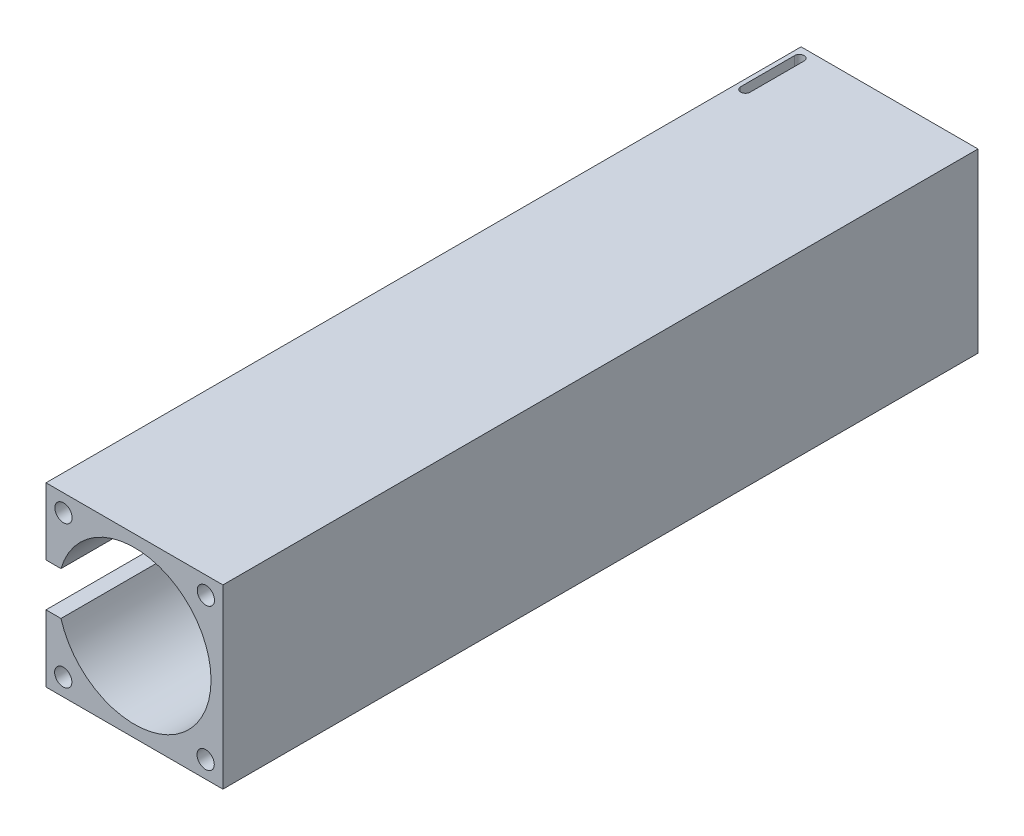
ISO-10303-21;
HEADER;
FILE_DESCRIPTION(('STEP AP214'),'2;1');
FILE_NAME('part.step','',(''),(''),'','','');
FILE_SCHEMA(('AUTOMOTIVE_DESIGN { 1 0 10303 214 1 1 1 1 }'));
ENDSEC;
DATA;
#1=APPLICATION_CONTEXT('core data for automotive mechanical design processes');
#2=APPLICATION_PROTOCOL_DEFINITION('international standard','automotive_design',2000,#1);
#3=PRODUCT_CONTEXT('',#1,'mechanical');
#4=PRODUCT('Part','Part','',(#3));
#5=PRODUCT_RELATED_PRODUCT_CATEGORY('part','',(#4));
#6=PRODUCT_DEFINITION_FORMATION('','',#4);
#7=PRODUCT_DEFINITION_CONTEXT('part definition',#1,'design');
#8=PRODUCT_DEFINITION('design','',#6,#7);
#9=PRODUCT_DEFINITION_SHAPE('','',#8);
#10=(LENGTH_UNIT() NAMED_UNIT(*) SI_UNIT(.MILLI.,.METRE.));
#11=(NAMED_UNIT(*) PLANE_ANGLE_UNIT() SI_UNIT($,.RADIAN.));
#12=(NAMED_UNIT(*) SI_UNIT($,.STERADIAN.) SOLID_ANGLE_UNIT());
#13=UNCERTAINTY_MEASURE_WITH_UNIT(LENGTH_MEASURE(1.E-05),#10,'distance_accuracy_value','');
#14=(GEOMETRIC_REPRESENTATION_CONTEXT(3) GLOBAL_UNCERTAINTY_ASSIGNED_CONTEXT((#13)) GLOBAL_UNIT_ASSIGNED_CONTEXT((#10,
#11,#12)) REPRESENTATION_CONTEXT('',''));
#15=CARTESIAN_POINT('',(0.,0.,0.));
#16=DIRECTION('',(0.,0.,1.));
#17=DIRECTION('',(1.,0.,0.));
#18=AXIS2_PLACEMENT_3D('',#15,#16,#17);
#19=CARTESIAN_POINT('',(-36.8,29.,-5.));
#20=DIRECTION('',(0.,1.,0.));
#21=DIRECTION('',(0.,0.,1.));
#22=AXIS2_PLACEMENT_3D('',#19,#20,#21);
#23=CYLINDRICAL_SURFACE('',#22,2.20000000000001);
#24=CARTESIAN_POINT('',(-36.8,36.,-5.));
#25=DIRECTION('',(0.,1.,0.));
#26=DIRECTION('',(0.,0.,1.));
#27=AXIS2_PLACEMENT_3D('',#24,#25,#26);
#28=CIRCLE('',#27,2.20000000000001);
#29=CARTESIAN_POINT('',(-34.6,36.,-5.));
#30=VERTEX_POINT('',#29);
#31=CARTESIAN_POINT('',(-36.8,36.,-2.8));
#32=VERTEX_POINT('',#31);
#33=EDGE_CURVE('E57',#30,#32,#28,.F.);
#34=ORIENTED_EDGE('',*,*,#33,.T.);
#35=CARTESIAN_POINT('',(-39.,36.,-5.));
#36=VERTEX_POINT('',#35);
#37=EDGE_CURVE('E244',#32,#36,#28,.F.);
#38=ORIENTED_EDGE('',*,*,#37,.T.);
#39=DIRECTION('',(0.,1.,0.));
#40=VECTOR('',#39,1.);
#41=CARTESIAN_POINT('',(-39.,29.,-5.));
#42=LINE('',#41,#40);
#43=CARTESIAN_POINT('',(-39.,41.,-5.));
#44=VERTEX_POINT('',#43);
#45=EDGE_CURVE('E277',#36,#44,#42,.T.);
#46=ORIENTED_EDGE('',*,*,#45,.T.);
#47=CARTESIAN_POINT('',(-36.8,41.,-5.));
#48=DIRECTION('',(0.,1.,0.));
#49=DIRECTION('',(0.,0.,1.));
#50=AXIS2_PLACEMENT_3D('',#47,#48,#49);
#51=CIRCLE('',#50,2.20000000000001);
#52=CARTESIAN_POINT('',(-34.6,41.,-4.99999999999995));
#53=VERTEX_POINT('',#52);
#54=EDGE_CURVE('E248',#44,#53,#51,.T.);
#55=ORIENTED_EDGE('',*,*,#54,.T.);
#56=DIRECTION('',(0.,1.,0.));
#57=VECTOR('',#56,1.);
#58=CARTESIAN_POINT('',(-34.6,29.,-5.));
#59=LINE('',#58,#57);
#60=EDGE_CURVE('E262',#30,#53,#59,.T.);
#61=ORIENTED_EDGE('',*,*,#60,.F.);
#62=EDGE_LOOP('',(#34,#38,#46,#55,#61));
#63=FACE_BOUND('',#62,.T.);
#64=ADVANCED_FACE('F34',(#63),#23,.F.);
#65=CARTESIAN_POINT('',(-39.,29.,-5.));
#66=DIRECTION('',(-1.,0.,0.));
#67=DIRECTION('',(0.,0.,1.));
#68=AXIS2_PLACEMENT_3D('',#65,#66,#67);
#69=PLANE('',#68);
#70=ORIENTED_EDGE('',*,*,#45,.F.);
#71=DIRECTION('',(0.,0.,-1.));
#72=VECTOR('',#71,1.);
#73=CARTESIAN_POINT('',(-39.,36.,-5.));
#74=LINE('',#73,#72);
#75=CARTESIAN_POINT('',(-39.,36.,-30.));
#76=VERTEX_POINT('',#75);
#77=EDGE_CURVE('E245',#36,#76,#74,.T.);
#78=ORIENTED_EDGE('',*,*,#77,.T.);
#79=DIRECTION('',(0.,1.,0.));
#80=VECTOR('',#79,1.);
#81=CARTESIAN_POINT('',(-39.,29.,-30.));
#82=LINE('',#81,#80);
#83=CARTESIAN_POINT('',(-39.,41.,-30.));
#84=VERTEX_POINT('',#83);
#85=EDGE_CURVE('E281',#76,#84,#82,.T.);
#86=ORIENTED_EDGE('',*,*,#85,.T.);
#87=DIRECTION('',(0.,0.,1.));
#88=VECTOR('',#87,1.);
#89=CARTESIAN_POINT('',(-39.,41.,-5.));
#90=LINE('',#89,#88);
#91=EDGE_CURVE('E253',#84,#44,#90,.T.);
#92=ORIENTED_EDGE('',*,*,#91,.T.);
#93=EDGE_LOOP('',(#70,#78,#86,#92));
#94=FACE_BOUND('',#93,.T.);
#95=ADVANCED_FACE('F416',(#94),#69,.F.);
#96=CARTESIAN_POINT('',(-36.8,29.,-30.));
#97=DIRECTION('',(0.,1.,0.));
#98=DIRECTION('',(0.,0.,1.));
#99=AXIS2_PLACEMENT_3D('',#96,#97,#98);
#100=CYLINDRICAL_SURFACE('',#99,2.20000000000001);
#101=CARTESIAN_POINT('',(-36.8,36.,-30.));
#102=DIRECTION('',(0.,1.,0.));
#103=DIRECTION('',(0.,0.,1.));
#104=AXIS2_PLACEMENT_3D('',#101,#102,#103);
#105=CIRCLE('',#104,2.20000000000001);
#106=CARTESIAN_POINT('',(-36.8,36.,-32.2));
#107=VERTEX_POINT('',#106);
#108=EDGE_CURVE('E242',#76,#107,#105,.F.);
#109=ORIENTED_EDGE('',*,*,#108,.T.);
#110=CARTESIAN_POINT('',(-34.6,36.,-30.));
#111=VERTEX_POINT('',#110);
#112=EDGE_CURVE('E239',#107,#111,#105,.F.);
#113=ORIENTED_EDGE('',*,*,#112,.T.);
#114=DIRECTION('',(0.,1.,0.));
#115=VECTOR('',#114,1.);
#116=CARTESIAN_POINT('',(-34.6,29.,-30.));
#117=LINE('',#116,#115);
#118=CARTESIAN_POINT('',(-34.6,41.,-30.));
#119=VERTEX_POINT('',#118);
#120=EDGE_CURVE('E285',#111,#119,#117,.T.);
#121=ORIENTED_EDGE('',*,*,#120,.T.);
#122=CARTESIAN_POINT('',(-36.8,41.,-30.));
#123=DIRECTION('',(0.,1.,0.));
#124=DIRECTION('',(0.,0.,1.));
#125=AXIS2_PLACEMENT_3D('',#122,#123,#124);
#126=CIRCLE('',#125,2.20000000000001);
#127=EDGE_CURVE('E268',#119,#84,#126,.T.);
#128=ORIENTED_EDGE('',*,*,#127,.T.);
#129=ORIENTED_EDGE('',*,*,#85,.F.);
#130=EDGE_LOOP('',(#109,#113,#121,#128,#129));
#131=FACE_BOUND('',#130,.T.);
#132=ADVANCED_FACE('F408',(#131),#100,.F.);
#133=CARTESIAN_POINT('',(-34.6,29.,-5.));
#134=DIRECTION('',(1.,0.,0.));
#135=DIRECTION('',(0.,0.,-1.));
#136=AXIS2_PLACEMENT_3D('',#133,#134,#135);
#137=PLANE('',#136);
#138=ORIENTED_EDGE('',*,*,#120,.F.);
#139=DIRECTION('',(0.,0.,1.));
#140=VECTOR('',#139,1.);
#141=CARTESIAN_POINT('',(-34.6,36.,-5.));
#142=LINE('',#141,#140);
#143=EDGE_CURVE('E11',#111,#30,#142,.T.);
#144=ORIENTED_EDGE('',*,*,#143,.T.);
#145=ORIENTED_EDGE('',*,*,#60,.T.);
#146=DIRECTION('',(0.,0.,-1.));
#147=VECTOR('',#146,1.);
#148=CARTESIAN_POINT('',(-34.6,41.,-5.));
#149=LINE('',#148,#147);
#150=EDGE_CURVE('E265',#53,#119,#149,.T.);
#151=ORIENTED_EDGE('',*,*,#150,.T.);
#152=EDGE_LOOP('',(#138,#144,#145,#151));
#153=FACE_BOUND('',#152,.T.);
#154=ADVANCED_FACE('F425',(#153),#137,.F.);
#155=CARTESIAN_POINT('',(0.,0.,315.));
#156=DIRECTION('',(0.,0.,-1.));
#157=DIRECTION('',(-1.,0.,0.));
#158=AXIS2_PLACEMENT_3D('',#155,#156,#157);
#159=PLANE('',#158);
#160=CARTESIAN_POINT('',(-32.9999999999981,-33.,315.));
#161=DIRECTION('',(0.,0.,1.));
#162=DIRECTION('',(1.,0.,0.));
#163=AXIS2_PLACEMENT_3D('',#160,#161,#162);
#164=CIRCLE('',#163,4.000000000001);
#165=CARTESIAN_POINT('',(-28.9999999999971,-33.,315.));
#166=VERTEX_POINT('',#165);
#167=EDGE_CURVE('E276',#166,#166,#164,.T.);
#168=ORIENTED_EDGE('',*,*,#167,.F.);
#169=EDGE_LOOP('',(#168));
#170=FACE_BOUND('',#169,.T.);
#171=CARTESIAN_POINT('',(33.0000000000019,-33.0999999999982,315.));
#172=DIRECTION('',(0.,0.,1.));
#173=DIRECTION('',(1.,0.,0.));
#174=AXIS2_PLACEMENT_3D('',#171,#172,#173);
#175=CIRCLE('',#174,4.00000000000001);
#176=CARTESIAN_POINT('',(37.0000000000019,-33.0999999999982,315.));
#177=VERTEX_POINT('',#176);
#178=EDGE_CURVE('E293',#177,#177,#175,.T.);
#179=ORIENTED_EDGE('',*,*,#178,.F.);
#180=EDGE_LOOP('',(#179));
#181=FACE_BOUND('',#180,.T.);
#182=CARTESIAN_POINT('',(33.1000000000001,32.9000000000018,315.));
#183=DIRECTION('',(0.,0.,1.));
#184=DIRECTION('',(1.,0.,0.));
#185=AXIS2_PLACEMENT_3D('',#182,#183,#184);
#186=CIRCLE('',#185,4.);
#187=CARTESIAN_POINT('',(37.1000000000001,32.9000000000018,315.));
#188=VERTEX_POINT('',#187);
#189=EDGE_CURVE('E289',#188,#188,#186,.T.);
#190=ORIENTED_EDGE('',*,*,#189,.F.);
#191=EDGE_LOOP('',(#190));
#192=FACE_BOUND('',#191,.T.);
#193=CARTESIAN_POINT('',(-32.9,33.,315.));
#194=DIRECTION('',(0.,0.,1.));
#195=DIRECTION('',(1.,0.,0.));
#196=AXIS2_PLACEMENT_3D('',#193,#194,#195);
#197=CIRCLE('',#196,4.);
#198=CARTESIAN_POINT('',(-28.9,33.,315.));
#199=VERTEX_POINT('',#198);
#200=EDGE_CURVE('E292',#199,#199,#197,.T.);
#201=ORIENTED_EDGE('',*,*,#200,.F.);
#202=EDGE_LOOP('',(#201));
#203=FACE_BOUND('',#202,.T.);
#204=CARTESIAN_POINT('',(0.,0.,315.));
#205=DIRECTION('',(0.,0.,1.));
#206=DIRECTION('',(1.,0.,0.));
#207=AXIS2_PLACEMENT_3D('',#204,#205,#206);
#208=CIRCLE('',#207,35.5);
#209=CARTESIAN_POINT('',(-34.0624426605022,-10.,315.));
#210=VERTEX_POINT('',#209);
#211=CARTESIAN_POINT('',(-34.0624426605022,10.,315.));
#212=VERTEX_POINT('',#211);
#213=EDGE_CURVE('E334',#210,#212,#208,.T.);
#214=ORIENTED_EDGE('',*,*,#213,.F.);
#215=DIRECTION('',(1.,0.,0.));
#216=VECTOR('',#215,1.);
#217=CARTESIAN_POINT('',(-41.,-10.,315.));
#218=LINE('',#217,#216);
#219=CARTESIAN_POINT('',(-41.,-10.,315.));
#220=VERTEX_POINT('',#219);
#221=EDGE_CURVE('E300',#220,#210,#218,.T.);
#222=ORIENTED_EDGE('',*,*,#221,.F.);
#223=DIRECTION('',(0.,-1.,0.));
#224=VECTOR('',#223,1.);
#225=CARTESIAN_POINT('',(-41.,-41.,315.));
#226=LINE('',#225,#224);
#227=CARTESIAN_POINT('',(-41.,-41.,315.));
#228=VERTEX_POINT('',#227);
#229=EDGE_CURVE('E337',#220,#228,#226,.T.);
#230=ORIENTED_EDGE('',*,*,#229,.T.);
#231=DIRECTION('',(1.,0.,0.));
#232=VECTOR('',#231,1.);
#233=CARTESIAN_POINT('',(-41.,-41.,315.));
#234=LINE('',#233,#232);
#235=CARTESIAN_POINT('',(41.,-41.,315.));
#236=VERTEX_POINT('',#235);
#237=EDGE_CURVE('E343',#228,#236,#234,.T.);
#238=ORIENTED_EDGE('',*,*,#237,.T.);
#239=DIRECTION('',(0.,1.,0.));
#240=VECTOR('',#239,1.);
#241=CARTESIAN_POINT('',(41.,-41.,315.));
#242=LINE('',#241,#240);
#243=CARTESIAN_POINT('',(41.,41.,315.));
#244=VERTEX_POINT('',#243);
#245=EDGE_CURVE('E345',#236,#244,#242,.T.);
#246=ORIENTED_EDGE('',*,*,#245,.T.);
#247=DIRECTION('',(-1.,0.,0.));
#248=VECTOR('',#247,1.);
#249=CARTESIAN_POINT('',(-41.,41.,315.));
#250=LINE('',#249,#248);
#251=CARTESIAN_POINT('',(-41.,41.,315.));
#252=VERTEX_POINT('',#251);
#253=EDGE_CURVE('E347',#244,#252,#250,.T.);
#254=ORIENTED_EDGE('',*,*,#253,.T.);
#255=CARTESIAN_POINT('',(-41.,10.,315.));
#256=VERTEX_POINT('',#255);
#257=EDGE_CURVE('E340',#252,#256,#226,.T.);
#258=ORIENTED_EDGE('',*,*,#257,.T.);
#259=DIRECTION('',(-1.,0.,0.));
#260=VECTOR('',#259,1.);
#261=CARTESIAN_POINT('',(-41.,10.,315.));
#262=LINE('',#261,#260);
#263=EDGE_CURVE('E301',#212,#256,#262,.T.);
#264=ORIENTED_EDGE('',*,*,#263,.F.);
#265=EDGE_LOOP('',(#214,#222,#230,#238,#246,#254,#258,#264));
#266=FACE_BOUND('',#265,.T.);
#267=ADVANCED_FACE('F427',(#170,#181,#192,#203,#266),#159,.F.);
#268=CARTESIAN_POINT('',(-41.,-41.,315.));
#269=DIRECTION('',(1.,0.,0.));
#270=DIRECTION('',(0.,0.,-1.));
#271=AXIS2_PLACEMENT_3D('',#268,#269,#270);
#272=PLANE('',#271);
#273=DIRECTION('',(0.,0.,1.));
#274=VECTOR('',#273,1.);
#275=CARTESIAN_POINT('',(-41.,33.,-32.2));
#276=LINE('',#275,#274);
#277=CARTESIAN_POINT('',(-41.,33.,-32.2));
#278=VERTEX_POINT('',#277);
#279=CARTESIAN_POINT('',(-41.,33.,-2.8));
#280=VERTEX_POINT('',#279);
#281=EDGE_CURVE('E217',#278,#280,#276,.T.);
#282=ORIENTED_EDGE('',*,*,#281,.F.);
#283=DIRECTION('',(0.,-1.,0.));
#284=VECTOR('',#283,1.);
#285=CARTESIAN_POINT('',(-41.,33.,-32.2));
#286=LINE('',#285,#284);
#287=CARTESIAN_POINT('',(-41.,36.,-32.2));
#288=VERTEX_POINT('',#287);
#289=EDGE_CURVE('E49',#288,#278,#286,.T.);
#290=ORIENTED_EDGE('',*,*,#289,.F.);
#291=DIRECTION('',(0.,0.,-1.));
#292=VECTOR('',#291,1.);
#293=CARTESIAN_POINT('',(-41.,36.,-32.2));
#294=LINE('',#293,#292);
#295=CARTESIAN_POINT('',(-41.,36.,-2.8));
#296=VERTEX_POINT('',#295);
#297=EDGE_CURVE('E208',#296,#288,#294,.T.);
#298=ORIENTED_EDGE('',*,*,#297,.F.);
#299=DIRECTION('',(0.,1.,0.));
#300=VECTOR('',#299,1.);
#301=CARTESIAN_POINT('',(-41.,33.,-2.8));
#302=LINE('',#301,#300);
#303=EDGE_CURVE('E211',#280,#296,#302,.T.);
#304=ORIENTED_EDGE('',*,*,#303,.F.);
#305=EDGE_LOOP('',(#282,#290,#298,#304));
#306=FACE_BOUND('',#305,.T.);
#307=ORIENTED_EDGE('',*,*,#229,.F.);
#308=DIRECTION('',(0.,0.,1.));
#309=VECTOR('',#308,1.);
#310=CARTESIAN_POINT('',(-41.,-10.,-21.540659228538));
#311=LINE('',#310,#309);
#312=CARTESIAN_POINT('',(-41.,-10.,0.));
#313=VERTEX_POINT('',#312);
#314=EDGE_CURVE('E311',#313,#220,#311,.T.);
#315=ORIENTED_EDGE('',*,*,#314,.F.);
#316=DIRECTION('',(0.,-1.,0.));
#317=VECTOR('',#316,1.);
#318=CARTESIAN_POINT('',(-41.,10.,0.));
#319=LINE('',#318,#317);
#320=CARTESIAN_POINT('',(-41.,10.,0.));
#321=VERTEX_POINT('',#320);
#322=EDGE_CURVE('E308',#321,#313,#319,.T.);
#323=ORIENTED_EDGE('',*,*,#322,.F.);
#324=DIRECTION('',(0.,0.,1.));
#325=VECTOR('',#324,1.);
#326=CARTESIAN_POINT('',(-41.,10.,-21.540659228538));
#327=LINE('',#326,#325);
#328=EDGE_CURVE('E312',#321,#256,#327,.T.);
#329=ORIENTED_EDGE('',*,*,#328,.T.);
#330=ORIENTED_EDGE('',*,*,#257,.F.);
#331=DIRECTION('',(0.,0.,-1.));
#332=VECTOR('',#331,1.);
#333=CARTESIAN_POINT('',(-41.,41.,315.));
#334=LINE('',#333,#332);
#335=CARTESIAN_POINT('',(-41.,41.,-35.));
#336=VERTEX_POINT('',#335);
#337=EDGE_CURVE('E349',#252,#336,#334,.T.);
#338=ORIENTED_EDGE('',*,*,#337,.T.);
#339=DIRECTION('',(0.,1.,0.));
#340=VECTOR('',#339,1.);
#341=CARTESIAN_POINT('',(-41.,41.,-35.));
#342=LINE('',#341,#340);
#343=CARTESIAN_POINT('',(-41.,-41.,-35.));
#344=VERTEX_POINT('',#343);
#345=EDGE_CURVE('E327',#344,#336,#342,.T.);
#346=ORIENTED_EDGE('',*,*,#345,.F.);
#347=DIRECTION('',(0.,0.,-1.));
#348=VECTOR('',#347,1.);
#349=CARTESIAN_POINT('',(-41.,-41.,315.));
#350=LINE('',#349,#348);
#351=EDGE_CURVE('E355',#228,#344,#350,.T.);
#352=ORIENTED_EDGE('',*,*,#351,.F.);
#353=EDGE_LOOP('',(#307,#315,#323,#329,#330,#338,#346,#352));
#354=FACE_BOUND('',#353,.T.);
#355=ADVANCED_FACE('F433',(#306,#354),#272,.F.);
#356=CARTESIAN_POINT('',(-41.,-41.,315.));
#357=DIRECTION('',(0.,1.,0.));
#358=DIRECTION('',(0.,0.,1.));
#359=AXIS2_PLACEMENT_3D('',#356,#357,#358);
#360=PLANE('',#359);
#361=ORIENTED_EDGE('',*,*,#351,.T.);
#362=DIRECTION('',(-1.,0.,0.));
#363=VECTOR('',#362,1.);
#364=CARTESIAN_POINT('',(41.,-41.,-35.));
#365=LINE('',#364,#363);
#366=CARTESIAN_POINT('',(41.,-41.,-35.));
#367=VERTEX_POINT('',#366);
#368=EDGE_CURVE('E324',#367,#344,#365,.T.);
#369=ORIENTED_EDGE('',*,*,#368,.F.);
#370=DIRECTION('',(0.,0.,-1.));
#371=VECTOR('',#370,1.);
#372=CARTESIAN_POINT('',(41.,-41.,315.));
#373=LINE('',#372,#371);
#374=EDGE_CURVE('E353',#236,#367,#373,.T.);
#375=ORIENTED_EDGE('',*,*,#374,.F.);
#376=ORIENTED_EDGE('',*,*,#237,.F.);
#377=EDGE_LOOP('',(#361,#369,#375,#376));
#378=FACE_BOUND('',#377,.T.);
#379=ADVANCED_FACE('F641',(#378),#360,.F.);
#380=CARTESIAN_POINT('',(41.,-41.,315.));
#381=DIRECTION('',(-1.,0.,0.));
#382=DIRECTION('',(0.,0.,1.));
#383=AXIS2_PLACEMENT_3D('',#380,#381,#382);
#384=PLANE('',#383);
#385=ORIENTED_EDGE('',*,*,#374,.T.);
#386=DIRECTION('',(0.,-1.,0.));
#387=VECTOR('',#386,1.);
#388=CARTESIAN_POINT('',(41.,41.,-35.));
#389=LINE('',#388,#387);
#390=CARTESIAN_POINT('',(41.,41.,-35.));
#391=VERTEX_POINT('',#390);
#392=EDGE_CURVE('E321',#391,#367,#389,.T.);
#393=ORIENTED_EDGE('',*,*,#392,.F.);
#394=DIRECTION('',(0.,0.,-1.));
#395=VECTOR('',#394,1.);
#396=CARTESIAN_POINT('',(41.,41.,315.));
#397=LINE('',#396,#395);
#398=EDGE_CURVE('E351',#244,#391,#397,.T.);
#399=ORIENTED_EDGE('',*,*,#398,.F.);
#400=ORIENTED_EDGE('',*,*,#245,.F.);
#401=EDGE_LOOP('',(#385,#393,#399,#400));
#402=FACE_BOUND('',#401,.T.);
#403=ADVANCED_FACE('F634',(#402),#384,.F.);
#404=CARTESIAN_POINT('',(-41.,41.,315.));
#405=DIRECTION('',(0.,-1.,0.));
#406=DIRECTION('',(0.,0.,-1.));
#407=AXIS2_PLACEMENT_3D('',#404,#405,#406);
#408=PLANE('',#407);
#409=ORIENTED_EDGE('',*,*,#150,.F.);
#410=ORIENTED_EDGE('',*,*,#54,.F.);
#411=ORIENTED_EDGE('',*,*,#91,.F.);
#412=ORIENTED_EDGE('',*,*,#127,.F.);
#413=EDGE_LOOP('',(#409,#410,#411,#412));
#414=FACE_BOUND('',#413,.T.);
#415=ORIENTED_EDGE('',*,*,#398,.T.);
#416=DIRECTION('',(1.,0.,0.));
#417=VECTOR('',#416,1.);
#418=CARTESIAN_POINT('',(41.,41.,-35.));
#419=LINE('',#418,#417);
#420=EDGE_CURVE('E330',#336,#391,#419,.T.);
#421=ORIENTED_EDGE('',*,*,#420,.F.);
#422=ORIENTED_EDGE('',*,*,#337,.F.);
#423=ORIENTED_EDGE('',*,*,#253,.F.);
#424=EDGE_LOOP('',(#415,#421,#422,#423));
#425=FACE_BOUND('',#424,.T.);
#426=ADVANCED_FACE('F422',(#414,#425),#408,.F.);
#427=CARTESIAN_POINT('',(0.,0.,315.));
#428=DIRECTION('',(0.,0.,-1.));
#429=DIRECTION('',(-1.,0.,0.));
#430=AXIS2_PLACEMENT_3D('',#427,#428,#429);
#431=CYLINDRICAL_SURFACE('',#430,35.5);
#432=DIRECTION('',(0.,0.,-1.));
#433=VECTOR('',#432,1.);
#434=CARTESIAN_POINT('',(-34.0624426605022,-10.,315.));
#435=LINE('',#434,#433);
#436=CARTESIAN_POINT('',(-34.0624426605022,-10.,0.));
#437=VERTEX_POINT('',#436);
#438=EDGE_CURVE('E319',#210,#437,#435,.T.);
#439=ORIENTED_EDGE('',*,*,#438,.F.);
#440=ORIENTED_EDGE('',*,*,#213,.T.);
#441=DIRECTION('',(0.,0.,-1.));
#442=VECTOR('',#441,1.);
#443=CARTESIAN_POINT('',(-34.0624426605022,10.,315.));
#444=LINE('',#443,#442);
#445=CARTESIAN_POINT('',(-34.0624426605022,10.,0.));
#446=VERTEX_POINT('',#445);
#447=EDGE_CURVE('E317',#446,#212,#444,.F.);
#448=ORIENTED_EDGE('',*,*,#447,.F.);
#449=CARTESIAN_POINT('',(0.,0.,0.));
#450=DIRECTION('',(0.,0.,1.));
#451=DIRECTION('',(1.,0.,0.));
#452=AXIS2_PLACEMENT_3D('',#449,#450,#451);
#453=CIRCLE('',#452,35.5);
#454=EDGE_CURVE('E333',#437,#446,#453,.T.);
#455=ORIENTED_EDGE('',*,*,#454,.F.);
#456=EDGE_LOOP('',(#439,#440,#448,#455));
#457=FACE_BOUND('',#456,.T.);
#458=ADVANCED_FACE('F621',(#457),#431,.F.);
#459=CARTESIAN_POINT('',(0.,0.,0.));
#460=DIRECTION('',(0.,0.,-1.));
#461=DIRECTION('',(-1.,0.,0.));
#462=AXIS2_PLACEMENT_3D('',#459,#460,#461);
#463=PLANE('',#462);
#464=ORIENTED_EDGE('',*,*,#454,.T.);
#465=DIRECTION('',(-1.,0.,0.));
#466=VECTOR('',#465,1.);
#467=CARTESIAN_POINT('',(-41.,10.,0.));
#468=LINE('',#467,#466);
#469=EDGE_CURVE('E307',#446,#321,#468,.T.);
#470=ORIENTED_EDGE('',*,*,#469,.T.);
#471=ORIENTED_EDGE('',*,*,#322,.T.);
#472=DIRECTION('',(1.,0.,0.));
#473=VECTOR('',#472,1.);
#474=CARTESIAN_POINT('',(-41.,-10.,0.));
#475=LINE('',#474,#473);
#476=EDGE_CURVE('E303',#313,#437,#475,.T.);
#477=ORIENTED_EDGE('',*,*,#476,.T.);
#478=EDGE_LOOP('',(#464,#470,#471,#477));
#479=FACE_BOUND('',#478,.T.);
#480=ADVANCED_FACE('F612',(#479),#463,.F.);
#481=CARTESIAN_POINT('',(0.,0.,-35.));
#482=DIRECTION('',(0.,0.,-1.));
#483=DIRECTION('',(-1.,0.,0.));
#484=AXIS2_PLACEMENT_3D('',#481,#482,#483);
#485=PLANE('',#484);
#486=ORIENTED_EDGE('',*,*,#392,.T.);
#487=ORIENTED_EDGE('',*,*,#368,.T.);
#488=ORIENTED_EDGE('',*,*,#345,.T.);
#489=ORIENTED_EDGE('',*,*,#420,.T.);
#490=EDGE_LOOP('',(#486,#487,#488,#489));
#491=FACE_BOUND('',#490,.T.);
#492=ADVANCED_FACE('F603',(#491),#485,.T.);
#493=CARTESIAN_POINT('',(-41.,-10.,-21.540659228538));
#494=DIRECTION('',(0.,-1.,0.));
#495=DIRECTION('',(0.,0.,-1.));
#496=AXIS2_PLACEMENT_3D('',#493,#494,#495);
#497=PLANE('',#496);
#498=ORIENTED_EDGE('',*,*,#438,.T.);
#499=ORIENTED_EDGE('',*,*,#476,.F.);
#500=ORIENTED_EDGE('',*,*,#314,.T.);
#501=ORIENTED_EDGE('',*,*,#221,.T.);
#502=EDGE_LOOP('',(#498,#499,#500,#501));
#503=FACE_BOUND('',#502,.T.);
#504=ADVANCED_FACE('F595',(#503),#497,.F.);
#505=CARTESIAN_POINT('',(-41.,10.,-21.540659228538));
#506=DIRECTION('',(0.,1.,0.));
#507=DIRECTION('',(0.,0.,1.));
#508=AXIS2_PLACEMENT_3D('',#505,#506,#507);
#509=PLANE('',#508);
#510=ORIENTED_EDGE('',*,*,#447,.T.);
#511=ORIENTED_EDGE('',*,*,#263,.T.);
#512=ORIENTED_EDGE('',*,*,#328,.F.);
#513=ORIENTED_EDGE('',*,*,#469,.F.);
#514=EDGE_LOOP('',(#510,#511,#512,#513));
#515=FACE_BOUND('',#514,.T.);
#516=ADVANCED_FACE('F586',(#515),#509,.F.);
#517=CARTESIAN_POINT('',(-32.9,33.,295.));
#518=DIRECTION('',(0.,0.,1.));
#519=DIRECTION('',(1.,0.,0.));
#520=AXIS2_PLACEMENT_3D('',#517,#518,#519);
#521=CYLINDRICAL_SURFACE('',#520,4.);
#522=CARTESIAN_POINT('',(-32.9,33.,298.));
#523=DIRECTION('',(0.,0.,1.));
#524=DIRECTION('',(1.,0.,0.));
#525=AXIS2_PLACEMENT_3D('',#522,#523,#524);
#526=CIRCLE('',#525,4.);
#527=CARTESIAN_POINT('',(-28.9,33.,298.));
#528=VERTEX_POINT('',#527);
#529=EDGE_CURVE('E360',#528,#528,#526,.F.);
#530=ORIENTED_EDGE('',*,*,#529,.T.);
#531=EDGE_LOOP('',(#530));
#532=FACE_BOUND('',#531,.T.);
#533=ORIENTED_EDGE('',*,*,#200,.T.);
#534=EDGE_LOOP('',(#533));
#535=FACE_BOUND('',#534,.T.);
#536=ADVANCED_FACE('F578',(#532,#535),#521,.F.);
#537=CARTESIAN_POINT('',(-32.9,33.,295.));
#538=DIRECTION('',(0.,0.,1.));
#539=DIRECTION('',(1.,0.,0.));
#540=AXIS2_PLACEMENT_3D('',#537,#538,#539);
#541=PLANE('',#540);
#542=CARTESIAN_POINT('',(-32.9,33.,295.));
#543=DIRECTION('',(0.,0.,1.));
#544=DIRECTION('',(1.,0.,0.));
#545=AXIS2_PLACEMENT_3D('',#542,#543,#544);
#546=CIRCLE('',#545,1.);
#547=CARTESIAN_POINT('',(-31.9,33.,295.));
#548=VERTEX_POINT('',#547);
#549=EDGE_CURVE('E357',#548,#548,#546,.T.);
#550=ORIENTED_EDGE('',*,*,#549,.T.);
#551=EDGE_LOOP('',(#550));
#552=FACE_BOUND('',#551,.T.);
#553=ADVANCED_FACE('F571',(#552),#541,.T.);
#554=CARTESIAN_POINT('',(33.1000000000001,32.9000000000018,295.));
#555=DIRECTION('',(0.,0.,1.));
#556=DIRECTION('',(1.,0.,0.));
#557=AXIS2_PLACEMENT_3D('',#554,#555,#556);
#558=CYLINDRICAL_SURFACE('',#557,4.);
#559=CARTESIAN_POINT('',(33.1000000000001,32.9000000000018,298.));
#560=DIRECTION('',(0.,0.,1.));
#561=DIRECTION('',(1.,0.,0.));
#562=AXIS2_PLACEMENT_3D('',#559,#560,#561);
#563=CIRCLE('',#562,4.);
#564=CARTESIAN_POINT('',(37.1000000000001,32.9000000000018,298.));
#565=VERTEX_POINT('',#564);
#566=EDGE_CURVE('E366',#565,#565,#563,.F.);
#567=ORIENTED_EDGE('',*,*,#566,.T.);
#568=EDGE_LOOP('',(#567));
#569=FACE_BOUND('',#568,.T.);
#570=ORIENTED_EDGE('',*,*,#189,.T.);
#571=EDGE_LOOP('',(#570));
#572=FACE_BOUND('',#571,.T.);
#573=ADVANCED_FACE('F565',(#569,#572),#558,.F.);
#574=CARTESIAN_POINT('',(33.1000000000001,32.9000000000018,295.));
#575=DIRECTION('',(0.,0.,1.));
#576=DIRECTION('',(1.,0.,0.));
#577=AXIS2_PLACEMENT_3D('',#574,#575,#576);
#578=PLANE('',#577);
#579=CARTESIAN_POINT('',(33.1000000000001,32.9000000000018,295.));
#580=DIRECTION('',(0.,0.,1.));
#581=DIRECTION('',(1.,0.,0.));
#582=AXIS2_PLACEMENT_3D('',#579,#580,#581);
#583=CIRCLE('',#582,0.999999999999997);
#584=CARTESIAN_POINT('',(34.1,32.9000000000018,295.));
#585=VERTEX_POINT('',#584);
#586=EDGE_CURVE('E363',#585,#585,#583,.T.);
#587=ORIENTED_EDGE('',*,*,#586,.T.);
#588=EDGE_LOOP('',(#587));
#589=FACE_BOUND('',#588,.T.);
#590=ADVANCED_FACE('F558',(#589),#578,.T.);
#591=CARTESIAN_POINT('',(33.0000000000019,-33.0999999999982,295.));
#592=DIRECTION('',(0.,0.,1.));
#593=DIRECTION('',(1.,0.,0.));
#594=AXIS2_PLACEMENT_3D('',#591,#592,#593);
#595=CYLINDRICAL_SURFACE('',#594,4.00000000000001);
#596=CARTESIAN_POINT('',(33.0000000000019,-33.0999999999982,298.));
#597=DIRECTION('',(0.,0.,1.));
#598=DIRECTION('',(1.,0.,0.));
#599=AXIS2_PLACEMENT_3D('',#596,#597,#598);
#600=CIRCLE('',#599,4.00000000000001);
#601=CARTESIAN_POINT('',(37.0000000000019,-33.0999999999982,298.));
#602=VERTEX_POINT('',#601);
#603=EDGE_CURVE('E378',#602,#602,#600,.F.);
#604=ORIENTED_EDGE('',*,*,#603,.T.);
#605=EDGE_LOOP('',(#604));
#606=FACE_BOUND('',#605,.T.);
#607=ORIENTED_EDGE('',*,*,#178,.T.);
#608=EDGE_LOOP('',(#607));
#609=FACE_BOUND('',#608,.T.);
#610=ADVANCED_FACE('F551',(#606,#609),#595,.F.);
#611=CARTESIAN_POINT('',(33.0000000000019,-33.0999999999982,295.));
#612=DIRECTION('',(0.,0.,1.));
#613=DIRECTION('',(1.,0.,0.));
#614=AXIS2_PLACEMENT_3D('',#611,#612,#613);
#615=PLANE('',#614);
#616=CARTESIAN_POINT('',(33.0000000000019,-33.0999999999982,295.));
#617=DIRECTION('',(0.,0.,1.));
#618=DIRECTION('',(1.,0.,0.));
#619=AXIS2_PLACEMENT_3D('',#616,#617,#618);
#620=CIRCLE('',#619,1.00000000000001);
#621=CARTESIAN_POINT('',(34.0000000000019,-33.0999999999982,295.));
#622=VERTEX_POINT('',#621);
#623=EDGE_CURVE('E375',#622,#622,#620,.T.);
#624=ORIENTED_EDGE('',*,*,#623,.T.);
#625=EDGE_LOOP('',(#624));
#626=FACE_BOUND('',#625,.T.);
#627=ADVANCED_FACE('F544',(#626),#615,.T.);
#628=CARTESIAN_POINT('',(-32.9999999999981,-33.,295.));
#629=DIRECTION('',(0.,0.,1.));
#630=DIRECTION('',(1.,0.,0.));
#631=AXIS2_PLACEMENT_3D('',#628,#629,#630);
#632=CYLINDRICAL_SURFACE('',#631,4.000000000001);
#633=CARTESIAN_POINT('',(-32.9999999999981,-33.,298.));
#634=DIRECTION('',(0.,0.,1.));
#635=DIRECTION('',(1.,0.,0.));
#636=AXIS2_PLACEMENT_3D('',#633,#634,#635);
#637=CIRCLE('',#636,4.000000000001);
#638=CARTESIAN_POINT('',(-28.9999999999971,-33.,298.));
#639=VERTEX_POINT('',#638);
#640=EDGE_CURVE('E372',#639,#639,#637,.F.);
#641=ORIENTED_EDGE('',*,*,#640,.T.);
#642=EDGE_LOOP('',(#641));
#643=FACE_BOUND('',#642,.T.);
#644=ORIENTED_EDGE('',*,*,#167,.T.);
#645=EDGE_LOOP('',(#644));
#646=FACE_BOUND('',#645,.T.);
#647=ADVANCED_FACE('F537',(#643,#646),#632,.F.);
#648=CARTESIAN_POINT('',(-32.9999999999981,-33.,295.));
#649=DIRECTION('',(0.,0.,1.));
#650=DIRECTION('',(1.,0.,0.));
#651=AXIS2_PLACEMENT_3D('',#648,#649,#650);
#652=PLANE('',#651);
#653=CARTESIAN_POINT('',(-32.9999999999981,-33.,295.));
#654=DIRECTION('',(0.,0.,1.));
#655=DIRECTION('',(1.,0.,0.));
#656=AXIS2_PLACEMENT_3D('',#653,#654,#655);
#657=CIRCLE('',#656,1.000000000001);
#658=CARTESIAN_POINT('',(-31.9999999999971,-33.,295.));
#659=VERTEX_POINT('',#658);
#660=EDGE_CURVE('E369',#659,#659,#657,.T.);
#661=ORIENTED_EDGE('',*,*,#660,.T.);
#662=EDGE_LOOP('',(#661));
#663=FACE_BOUND('',#662,.T.);
#664=ADVANCED_FACE('F528',(#663),#652,.T.);
#665=CARTESIAN_POINT('',(-32.9,33.,298.));
#666=DIRECTION('',(0.,0.,1.));
#667=DIRECTION('',(1.,0.,0.));
#668=AXIS2_PLACEMENT_3D('',#665,#666,#667);
#669=DEGENERATE_TOROIDAL_SURFACE('',#668,1.,3.,.T.);
#670=ORIENTED_EDGE('',*,*,#529,.F.);
#671=EDGE_LOOP('',(#670));
#672=FACE_BOUND('',#671,.T.);
#673=ORIENTED_EDGE('',*,*,#549,.F.);
#674=EDGE_LOOP('',(#673));
#675=FACE_BOUND('',#674,.T.);
#676=ADVANCED_FACE('F518',(#672,#675),#669,.F.);
#677=CARTESIAN_POINT('',(33.1000000000001,32.9000000000018,298.));
#678=DIRECTION('',(0.,0.,1.));
#679=DIRECTION('',(1.,0.,0.));
#680=AXIS2_PLACEMENT_3D('',#677,#678,#679);
#681=DEGENERATE_TOROIDAL_SURFACE('',#680,0.999999999999997,3.,.T.);
#682=ORIENTED_EDGE('',*,*,#566,.F.);
#683=EDGE_LOOP('',(#682));
#684=FACE_BOUND('',#683,.T.);
#685=ORIENTED_EDGE('',*,*,#586,.F.);
#686=EDGE_LOOP('',(#685));
#687=FACE_BOUND('',#686,.T.);
#688=ADVANCED_FACE('F509',(#684,#687),#681,.F.);
#689=CARTESIAN_POINT('',(-32.9999999999981,-33.,298.));
#690=DIRECTION('',(0.,0.,1.));
#691=DIRECTION('',(1.,0.,0.));
#692=AXIS2_PLACEMENT_3D('',#689,#690,#691);
#693=DEGENERATE_TOROIDAL_SURFACE('',#692,1.000000000001,3.,.T.);
#694=ORIENTED_EDGE('',*,*,#640,.F.);
#695=EDGE_LOOP('',(#694));
#696=FACE_BOUND('',#695,.T.);
#697=ORIENTED_EDGE('',*,*,#660,.F.);
#698=EDGE_LOOP('',(#697));
#699=FACE_BOUND('',#698,.T.);
#700=ADVANCED_FACE('F500',(#696,#699),#693,.F.);
#701=CARTESIAN_POINT('',(33.0000000000019,-33.0999999999982,298.));
#702=DIRECTION('',(0.,0.,1.));
#703=DIRECTION('',(1.,0.,0.));
#704=AXIS2_PLACEMENT_3D('',#701,#702,#703);
#705=DEGENERATE_TOROIDAL_SURFACE('',#704,1.00000000000001,3.,.T.);
#706=ORIENTED_EDGE('',*,*,#603,.F.);
#707=EDGE_LOOP('',(#706));
#708=FACE_BOUND('',#707,.T.);
#709=ORIENTED_EDGE('',*,*,#623,.F.);
#710=EDGE_LOOP('',(#709));
#711=FACE_BOUND('',#710,.T.);
#712=ADVANCED_FACE('F36',(#708,#711),#705,.F.);
#713=CARTESIAN_POINT('',(-31.,33.,-2.8));
#714=DIRECTION('',(0.,0.,1.));
#715=DIRECTION('',(1.,0.,0.));
#716=AXIS2_PLACEMENT_3D('',#713,#714,#715);
#717=PLANE('',#716);
#718=DIRECTION('',(-1.,0.,0.));
#719=VECTOR('',#718,1.);
#720=CARTESIAN_POINT('',(-31.,36.,-2.8));
#721=LINE('',#720,#719);
#722=CARTESIAN_POINT('',(-31.,36.,-2.8));
#723=VERTEX_POINT('',#722);
#724=EDGE_CURVE('E226',#723,#32,#721,.T.);
#725=ORIENTED_EDGE('',*,*,#724,.F.);
#726=DIRECTION('',(0.,1.,0.));
#727=VECTOR('',#726,1.);
#728=CARTESIAN_POINT('',(-31.,33.,-2.8));
#729=LINE('',#728,#727);
#730=CARTESIAN_POINT('',(-31.,33.,-2.8));
#731=VERTEX_POINT('',#730);
#732=EDGE_CURVE('E203',#731,#723,#729,.T.);
#733=ORIENTED_EDGE('',*,*,#732,.F.);
#734=DIRECTION('',(-1.,0.,0.));
#735=VECTOR('',#734,1.);
#736=CARTESIAN_POINT('',(-31.,33.,-2.8));
#737=LINE('',#736,#735);
#738=CARTESIAN_POINT('',(-36.8,33.,-2.8));
#739=VERTEX_POINT('',#738);
#740=EDGE_CURVE('E199',#731,#739,#737,.T.);
#741=ORIENTED_EDGE('',*,*,#740,.T.);
#742=EDGE_CURVE('E193',#739,#280,#737,.T.);
#743=ORIENTED_EDGE('',*,*,#742,.T.);
#744=ORIENTED_EDGE('',*,*,#303,.T.);
#745=EDGE_CURVE('E228',#32,#296,#721,.T.);
#746=ORIENTED_EDGE('',*,*,#745,.F.);
#747=EDGE_LOOP('',(#725,#733,#741,#743,#744,#746));
#748=FACE_BOUND('',#747,.T.);
#749=ADVANCED_FACE('F401',(#748),#717,.F.);
#750=CARTESIAN_POINT('',(-31.,33.,-32.2));
#751=DIRECTION('',(0.,0.,-1.));
#752=DIRECTION('',(-1.,0.,0.));
#753=AXIS2_PLACEMENT_3D('',#750,#751,#752);
#754=PLANE('',#753);
#755=DIRECTION('',(-1.,0.,0.));
#756=VECTOR('',#755,1.);
#757=CARTESIAN_POINT('',(-31.,36.,-32.2));
#758=LINE('',#757,#756);
#759=EDGE_CURVE('E225',#107,#288,#758,.T.);
#760=ORIENTED_EDGE('',*,*,#759,.T.);
#761=ORIENTED_EDGE('',*,*,#289,.T.);
#762=DIRECTION('',(-1.,0.,0.));
#763=VECTOR('',#762,1.);
#764=CARTESIAN_POINT('',(-31.,33.,-32.2));
#765=LINE('',#764,#763);
#766=CARTESIAN_POINT('',(-36.8,33.,-32.2));
#767=VERTEX_POINT('',#766);
#768=EDGE_CURVE('E190',#767,#278,#765,.T.);
#769=ORIENTED_EDGE('',*,*,#768,.F.);
#770=CARTESIAN_POINT('',(-31.,33.,-32.2));
#771=VERTEX_POINT('',#770);
#772=EDGE_CURVE('E183',#771,#767,#765,.T.);
#773=ORIENTED_EDGE('',*,*,#772,.F.);
#774=DIRECTION('',(0.,-1.,0.));
#775=VECTOR('',#774,1.);
#776=CARTESIAN_POINT('',(-31.,33.,-32.2));
#777=LINE('',#776,#775);
#778=CARTESIAN_POINT('',(-31.,36.,-32.2));
#779=VERTEX_POINT('',#778);
#780=EDGE_CURVE('E188',#779,#771,#777,.T.);
#781=ORIENTED_EDGE('',*,*,#780,.F.);
#782=EDGE_CURVE('E222',#779,#107,#758,.T.);
#783=ORIENTED_EDGE('',*,*,#782,.T.);
#784=EDGE_LOOP('',(#760,#761,#769,#773,#781,#783));
#785=FACE_BOUND('',#784,.T.);
#786=ADVANCED_FACE('F185',(#785),#754,.F.);
#787=CARTESIAN_POINT('',(-31.,36.,-32.2));
#788=DIRECTION('',(0.,1.,0.));
#789=DIRECTION('',(0.,0.,1.));
#790=AXIS2_PLACEMENT_3D('',#787,#788,#789);
#791=PLANE('',#790);
#792=ORIENTED_EDGE('',*,*,#37,.F.);
#793=ORIENTED_EDGE('',*,*,#745,.T.);
#794=ORIENTED_EDGE('',*,*,#297,.T.);
#795=ORIENTED_EDGE('',*,*,#759,.F.);
#796=ORIENTED_EDGE('',*,*,#108,.F.);
#797=ORIENTED_EDGE('',*,*,#77,.F.);
#798=EDGE_LOOP('',(#792,#793,#794,#795,#796,#797));
#799=FACE_BOUND('',#798,.T.);
#800=ADVANCED_FACE('F459',(#799),#791,.F.);
#801=ORIENTED_EDGE('',*,*,#143,.F.);
#802=ORIENTED_EDGE('',*,*,#112,.F.);
#803=ORIENTED_EDGE('',*,*,#782,.F.);
#804=DIRECTION('',(0.,0.,-1.));
#805=VECTOR('',#804,1.);
#806=CARTESIAN_POINT('',(-31.,36.,-32.2));
#807=LINE('',#806,#805);
#808=EDGE_CURVE('E207',#723,#779,#807,.T.);
#809=ORIENTED_EDGE('',*,*,#808,.F.);
#810=ORIENTED_EDGE('',*,*,#724,.T.);
#811=ORIENTED_EDGE('',*,*,#33,.F.);
#812=EDGE_LOOP('',(#801,#802,#803,#809,#810,#811));
#813=FACE_BOUND('',#812,.T.);
#814=ADVANCED_FACE('F403',(#813),#791,.F.);
#815=CARTESIAN_POINT('',(-31.,33.,-32.2));
#816=DIRECTION('',(0.,-1.,0.));
#817=DIRECTION('',(0.,0.,-1.));
#818=AXIS2_PLACEMENT_3D('',#815,#816,#817);
#819=PLANE('',#818);
#820=ORIENTED_EDGE('',*,*,#740,.F.);
#821=DIRECTION('',(0.,0.,1.));
#822=VECTOR('',#821,1.);
#823=CARTESIAN_POINT('',(-31.,33.,-32.2));
#824=LINE('',#823,#822);
#825=EDGE_CURVE('E196',#771,#731,#824,.T.);
#826=ORIENTED_EDGE('',*,*,#825,.F.);
#827=ORIENTED_EDGE('',*,*,#772,.T.);
#828=CARTESIAN_POINT('',(-36.8,33.,-30.));
#829=DIRECTION('',(0.,-1.,0.));
#830=DIRECTION('',(0.,0.,-1.));
#831=AXIS2_PLACEMENT_3D('',#828,#829,#830);
#832=CIRCLE('',#831,2.20000000000001);
#833=CARTESIAN_POINT('',(-34.6,33.,-30.));
#834=VERTEX_POINT('',#833);
#835=EDGE_CURVE('E224',#834,#767,#832,.F.);
#836=ORIENTED_EDGE('',*,*,#835,.F.);
#837=DIRECTION('',(0.,0.,-1.));
#838=VECTOR('',#837,1.);
#839=CARTESIAN_POINT('',(-34.6,33.,-5.));
#840=LINE('',#839,#838);
#841=CARTESIAN_POINT('',(-34.6,33.,-5.));
#842=VERTEX_POINT('',#841);
#843=EDGE_CURVE('E42',#842,#834,#840,.T.);
#844=ORIENTED_EDGE('',*,*,#843,.F.);
#845=CARTESIAN_POINT('',(-36.8,33.,-5.));
#846=DIRECTION('',(0.,-1.,0.));
#847=DIRECTION('',(0.,0.,-1.));
#848=AXIS2_PLACEMENT_3D('',#845,#846,#847);
#849=CIRCLE('',#848,2.20000000000001);
#850=EDGE_CURVE('E238',#739,#842,#849,.F.);
#851=ORIENTED_EDGE('',*,*,#850,.F.);
#852=EDGE_LOOP('',(#820,#826,#827,#836,#844,#851));
#853=FACE_BOUND('',#852,.T.);
#854=ADVANCED_FACE('F197',(#853),#819,.F.);
#855=DIRECTION('',(0.,0.,1.));
#856=VECTOR('',#855,1.);
#857=CARTESIAN_POINT('',(-39.,33.,-5.));
#858=LINE('',#857,#856);
#859=CARTESIAN_POINT('',(-39.,33.,-30.));
#860=VERTEX_POINT('',#859);
#861=CARTESIAN_POINT('',(-39.,33.,-5.));
#862=VERTEX_POINT('',#861);
#863=EDGE_CURVE('E232',#860,#862,#858,.T.);
#864=ORIENTED_EDGE('',*,*,#863,.F.);
#865=EDGE_CURVE('E231',#767,#860,#832,.F.);
#866=ORIENTED_EDGE('',*,*,#865,.F.);
#867=ORIENTED_EDGE('',*,*,#768,.T.);
#868=ORIENTED_EDGE('',*,*,#281,.T.);
#869=ORIENTED_EDGE('',*,*,#742,.F.);
#870=EDGE_CURVE('E235',#862,#739,#849,.F.);
#871=ORIENTED_EDGE('',*,*,#870,.F.);
#872=EDGE_LOOP('',(#864,#866,#867,#868,#869,#871));
#873=FACE_BOUND('',#872,.T.);
#874=ADVANCED_FACE('F397',(#873),#819,.F.);
#875=CARTESIAN_POINT('',(-31.,0.,0.));
#876=DIRECTION('',(1.,0.,0.));
#877=DIRECTION('',(0.,0.,-1.));
#878=AXIS2_PLACEMENT_3D('',#875,#876,#877);
#879=PLANE('',#878);
#880=ORIENTED_EDGE('',*,*,#780,.T.);
#881=ORIENTED_EDGE('',*,*,#825,.T.);
#882=ORIENTED_EDGE('',*,*,#732,.T.);
#883=ORIENTED_EDGE('',*,*,#808,.T.);
#884=EDGE_LOOP('',(#880,#881,#882,#883));
#885=FACE_BOUND('',#884,.T.);
#886=ADVANCED_FACE('F205',(#885),#879,.F.);
#887=CARTESIAN_POINT('',(-36.8,29.,-5.));
#888=DIRECTION('',(0.,1.,0.));
#889=DIRECTION('',(0.,0.,1.));
#890=AXIS2_PLACEMENT_3D('',#887,#888,#889);
#891=PLANE('',#890);
#892=CARTESIAN_POINT('',(-36.8,29.,-5.));
#893=DIRECTION('',(0.,1.,0.));
#894=DIRECTION('',(0.,0.,1.));
#895=AXIS2_PLACEMENT_3D('',#892,#893,#894);
#896=CIRCLE('',#895,2.20000000000001);
#897=CARTESIAN_POINT('',(-39.,29.,-5.));
#898=VERTEX_POINT('',#897);
#899=CARTESIAN_POINT('',(-34.6,29.,-5.));
#900=VERTEX_POINT('',#899);
#901=EDGE_CURVE('E249',#898,#900,#896,.T.);
#902=ORIENTED_EDGE('',*,*,#901,.T.);
#903=DIRECTION('',(0.,0.,-1.));
#904=VECTOR('',#903,1.);
#905=CARTESIAN_POINT('',(-34.6,29.,-5.));
#906=LINE('',#905,#904);
#907=CARTESIAN_POINT('',(-34.6,29.,-30.));
#908=VERTEX_POINT('',#907);
#909=EDGE_CURVE('E252',#900,#908,#906,.T.);
#910=ORIENTED_EDGE('',*,*,#909,.T.);
#911=CARTESIAN_POINT('',(-36.8,29.,-30.));
#912=DIRECTION('',(0.,1.,0.));
#913=DIRECTION('',(0.,0.,1.));
#914=AXIS2_PLACEMENT_3D('',#911,#912,#913);
#915=CIRCLE('',#914,2.20000000000001);
#916=CARTESIAN_POINT('',(-39.,29.,-30.));
#917=VERTEX_POINT('',#916);
#918=EDGE_CURVE('E256',#908,#917,#915,.T.);
#919=ORIENTED_EDGE('',*,*,#918,.T.);
#920=DIRECTION('',(0.,0.,1.));
#921=VECTOR('',#920,1.);
#922=CARTESIAN_POINT('',(-39.,29.,-5.));
#923=LINE('',#922,#921);
#924=EDGE_CURVE('E259',#917,#898,#923,.T.);
#925=ORIENTED_EDGE('',*,*,#924,.T.);
#926=EDGE_LOOP('',(#902,#910,#919,#925));
#927=FACE_BOUND('',#926,.T.);
#928=ADVANCED_FACE('F391',(#927),#891,.T.);
#929=EDGE_CURVE('E286',#900,#842,#59,.T.);
#930=ORIENTED_EDGE('',*,*,#929,.T.);
#931=ORIENTED_EDGE('',*,*,#843,.T.);
#932=EDGE_CURVE('E282',#908,#834,#117,.T.);
#933=ORIENTED_EDGE('',*,*,#932,.F.);
#934=ORIENTED_EDGE('',*,*,#909,.F.);
#935=EDGE_LOOP('',(#930,#931,#933,#934));
#936=FACE_BOUND('',#935,.T.);
#937=ADVANCED_FACE('F382',(#936),#137,.F.);
#938=ORIENTED_EDGE('',*,*,#835,.T.);
#939=ORIENTED_EDGE('',*,*,#865,.T.);
#940=EDGE_CURVE('E278',#917,#860,#82,.T.);
#941=ORIENTED_EDGE('',*,*,#940,.F.);
#942=ORIENTED_EDGE('',*,*,#918,.F.);
#943=ORIENTED_EDGE('',*,*,#932,.T.);
#944=EDGE_LOOP('',(#938,#939,#941,#942,#943));
#945=FACE_BOUND('',#944,.T.);
#946=ADVANCED_FACE('F387',(#945),#100,.F.);
#947=ORIENTED_EDGE('',*,*,#940,.T.);
#948=ORIENTED_EDGE('',*,*,#863,.T.);
#949=EDGE_CURVE('E273',#898,#862,#42,.T.);
#950=ORIENTED_EDGE('',*,*,#949,.F.);
#951=ORIENTED_EDGE('',*,*,#924,.F.);
#952=EDGE_LOOP('',(#947,#948,#950,#951));
#953=FACE_BOUND('',#952,.T.);
#954=ADVANCED_FACE('F444',(#953),#69,.F.);
#955=ORIENTED_EDGE('',*,*,#870,.T.);
#956=ORIENTED_EDGE('',*,*,#850,.T.);
#957=ORIENTED_EDGE('',*,*,#929,.F.);
#958=ORIENTED_EDGE('',*,*,#901,.F.);
#959=ORIENTED_EDGE('',*,*,#949,.T.);
#960=EDGE_LOOP('',(#955,#956,#957,#958,#959));
#961=FACE_BOUND('',#960,.T.);
#962=ADVANCED_FACE('F394',(#961),#23,.F.);
#963=CLOSED_SHELL('',(#64,#95,#132,#154,#267,#355,#379,#403,#426,#458,#480,#492,#504,#516,#536,
#553,#573,#590,#610,#627,#647,#664,#676,#688,#700,#712,#749,#786,#800,#814,#854,#874,#886,#928,
#937,#946,#954,#962));
#964=MANIFOLD_SOLID_BREP('B2',#963);
#965=ADVANCED_BREP_SHAPE_REPRESENTATION('',(#18,#964),#14);
#966=SHAPE_DEFINITION_REPRESENTATION(#9,#965);
ENDSEC;
END-ISO-10303-21;
